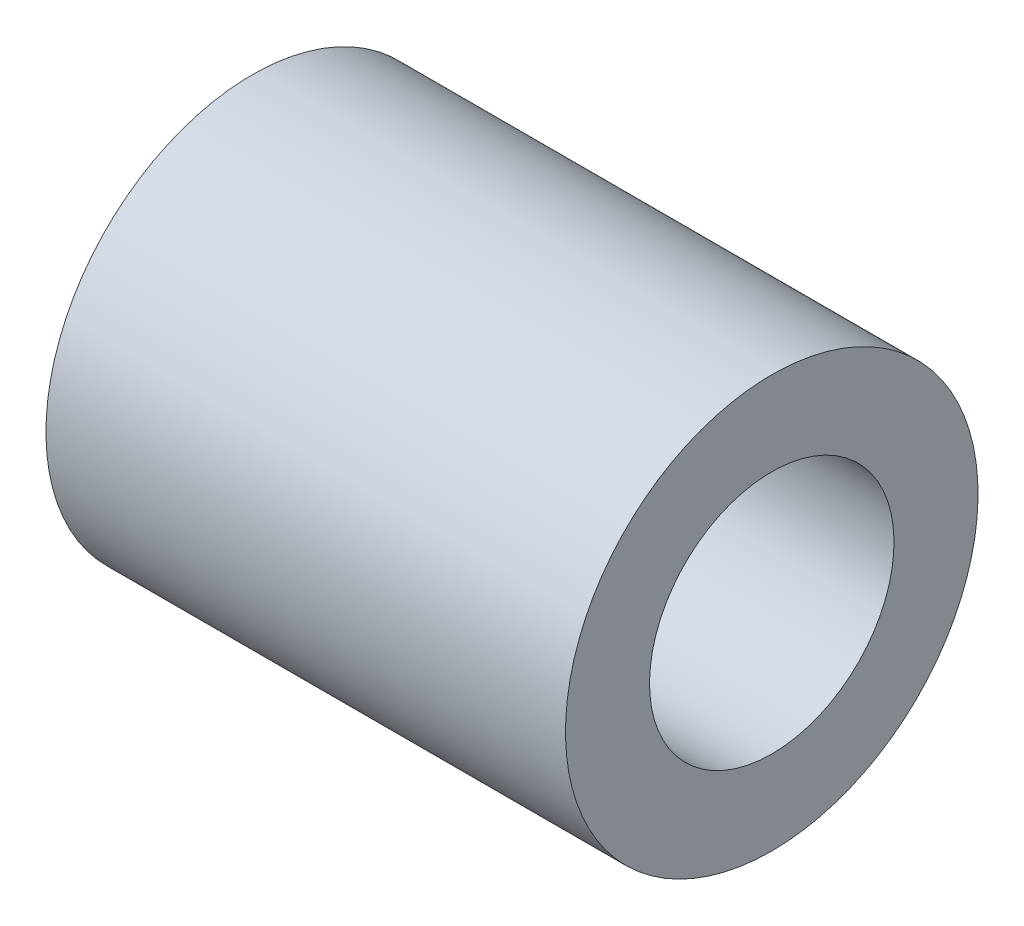
ISO-10303-21;
HEADER;
FILE_DESCRIPTION(('STEP AP214'),'2;1');
FILE_NAME('part.step','',(''),(''),'','','');
FILE_SCHEMA(('AUTOMOTIVE_DESIGN { 1 0 10303 214 1 1 1 1 }'));
ENDSEC;
DATA;
#1=APPLICATION_CONTEXT('core data for automotive mechanical design processes');
#2=APPLICATION_PROTOCOL_DEFINITION('international standard','automotive_design',2000,#1);
#3=PRODUCT_CONTEXT('',#1,'mechanical');
#4=PRODUCT('Part','Part','',(#3));
#5=PRODUCT_RELATED_PRODUCT_CATEGORY('part','',(#4));
#6=PRODUCT_DEFINITION_FORMATION('','',#4);
#7=PRODUCT_DEFINITION_CONTEXT('part definition',#1,'design');
#8=PRODUCT_DEFINITION('design','',#6,#7);
#9=PRODUCT_DEFINITION_SHAPE('','',#8);
#10=(LENGTH_UNIT() NAMED_UNIT(*) SI_UNIT(.MILLI.,.METRE.));
#11=(NAMED_UNIT(*) PLANE_ANGLE_UNIT() SI_UNIT($,.RADIAN.));
#12=(NAMED_UNIT(*) SI_UNIT($,.STERADIAN.) SOLID_ANGLE_UNIT());
#13=UNCERTAINTY_MEASURE_WITH_UNIT(LENGTH_MEASURE(1.E-05),#10,'distance_accuracy_value','');
#14=(GEOMETRIC_REPRESENTATION_CONTEXT(3) GLOBAL_UNCERTAINTY_ASSIGNED_CONTEXT((#13)) GLOBAL_UNIT_ASSIGNED_CONTEXT((#10,
#11,#12)) REPRESENTATION_CONTEXT('',''));
#15=CARTESIAN_POINT('',(0.,0.,0.));
#16=DIRECTION('',(0.,0.,1.));
#17=DIRECTION('',(1.,0.,0.));
#18=AXIS2_PLACEMENT_3D('',#15,#16,#17);
#19=CARTESIAN_POINT('',(46.3999999999994,-40.4999999767539,-34.0550000158043));
#20=DIRECTION('',(-1.,0.,0.));
#21=DIRECTION('',(0.,-1.,0.));
#22=AXIS2_PLACEMENT_3D('',#19,#20,#21);
#23=CYLINDRICAL_SURFACE('',#22,0.4);
#24=CARTESIAN_POINT('',(48.0999999999994,-40.4999999767539,-34.0550000158043));
#25=DIRECTION('',(-1.,0.,0.));
#26=DIRECTION('',(0.,-1.,0.));
#27=AXIS2_PLACEMENT_3D('',#24,#25,#26);
#28=CIRCLE('',#27,0.4);
#29=CARTESIAN_POINT('',(48.0999999999994,-40.8999999767539,-34.0550000158043));
#30=VERTEX_POINT('',#29);
#31=EDGE_CURVE('E27',#30,#30,#28,.F.);
#32=ORIENTED_EDGE('',*,*,#31,.T.);
#33=EDGE_LOOP('',(#32));
#34=FACE_BOUND('',#33,.T.);
#35=CARTESIAN_POINT('',(46.3999999999994,-40.4999999767539,-34.0550000158043));
#36=DIRECTION('',(-1.,0.,0.));
#37=DIRECTION('',(0.,-1.,0.));
#38=AXIS2_PLACEMENT_3D('',#35,#36,#37);
#39=CIRCLE('',#38,0.4);
#40=CARTESIAN_POINT('',(46.3999999999994,-40.8999999767539,-34.0550000158043));
#41=VERTEX_POINT('',#40);
#42=EDGE_CURVE('E18',#41,#41,#39,.F.);
#43=ORIENTED_EDGE('',*,*,#42,.F.);
#44=EDGE_LOOP('',(#43));
#45=FACE_BOUND('',#44,.T.);
#46=ADVANCED_FACE('F15',(#34,#45),#23,.F.);
#47=CARTESIAN_POINT('',(46.3999999999995,-9.82652232088982E-12,0.));
#48=DIRECTION('',(-1.,0.,0.));
#49=DIRECTION('',(0.,-1.,0.));
#50=AXIS2_PLACEMENT_3D('',#47,#48,#49);
#51=PLANE('',#50);
#52=CARTESIAN_POINT('',(46.3999999999994,-40.4999999767539,-34.0550000158043));
#53=DIRECTION('',(-1.,0.,0.));
#54=DIRECTION('',(0.,-1.,0.));
#55=AXIS2_PLACEMENT_3D('',#52,#53,#54);
#56=CIRCLE('',#55,0.675);
#57=CARTESIAN_POINT('',(46.3999999999994,-41.1749999767539,-34.0550000158043));
#58=VERTEX_POINT('',#57);
#59=EDGE_CURVE('E22',#58,#58,#56,.F.);
#60=ORIENTED_EDGE('',*,*,#59,.F.);
#61=EDGE_LOOP('',(#60));
#62=FACE_BOUND('',#61,.T.);
#63=ORIENTED_EDGE('',*,*,#42,.T.);
#64=EDGE_LOOP('',(#63));
#65=FACE_BOUND('',#64,.T.);
#66=ADVANCED_FACE('F35',(#62,#65),#51,.T.);
#67=CARTESIAN_POINT('',(48.0999999999995,-9.83167444961347E-12,0.));
#68=DIRECTION('',(-1.,0.,0.));
#69=DIRECTION('',(0.,-1.,0.));
#70=AXIS2_PLACEMENT_3D('',#67,#68,#69);
#71=PLANE('',#70);
#72=CARTESIAN_POINT('',(48.0999999999994,-40.4999999767539,-34.0550000158043));
#73=DIRECTION('',(-1.,0.,0.));
#74=DIRECTION('',(0.,-1.,0.));
#75=AXIS2_PLACEMENT_3D('',#72,#73,#74);
#76=CIRCLE('',#75,0.675);
#77=CARTESIAN_POINT('',(48.0999999999994,-41.1749999767539,-34.0550000158043));
#78=VERTEX_POINT('',#77);
#79=EDGE_CURVE('E10',#78,#78,#76,.T.);
#80=ORIENTED_EDGE('',*,*,#79,.F.);
#81=EDGE_LOOP('',(#80));
#82=FACE_BOUND('',#81,.T.);
#83=ORIENTED_EDGE('',*,*,#31,.F.);
#84=EDGE_LOOP('',(#83));
#85=FACE_BOUND('',#84,.T.);
#86=ADVANCED_FACE('F42',(#82,#85),#71,.F.);
#87=CARTESIAN_POINT('',(46.3999999999994,-40.4999999767539,-34.0550000158043));
#88=DIRECTION('',(-1.,0.,0.));
#89=DIRECTION('',(0.,-1.,0.));
#90=AXIS2_PLACEMENT_3D('',#87,#88,#89);
#91=CYLINDRICAL_SURFACE('',#90,0.675);
#92=ORIENTED_EDGE('',*,*,#79,.T.);
#93=EDGE_LOOP('',(#92));
#94=FACE_BOUND('',#93,.T.);
#95=ORIENTED_EDGE('',*,*,#59,.T.);
#96=EDGE_LOOP('',(#95));
#97=FACE_BOUND('',#96,.T.);
#98=ADVANCED_FACE('F44',(#94,#97),#91,.T.);
#99=CLOSED_SHELL('',(#46,#66,#86,#98));
#100=MANIFOLD_SOLID_BREP('B1',#99);
#101=ADVANCED_BREP_SHAPE_REPRESENTATION('',(#18,#100),#14);
#102=SHAPE_DEFINITION_REPRESENTATION(#9,#101);
ENDSEC;
END-ISO-10303-21;
